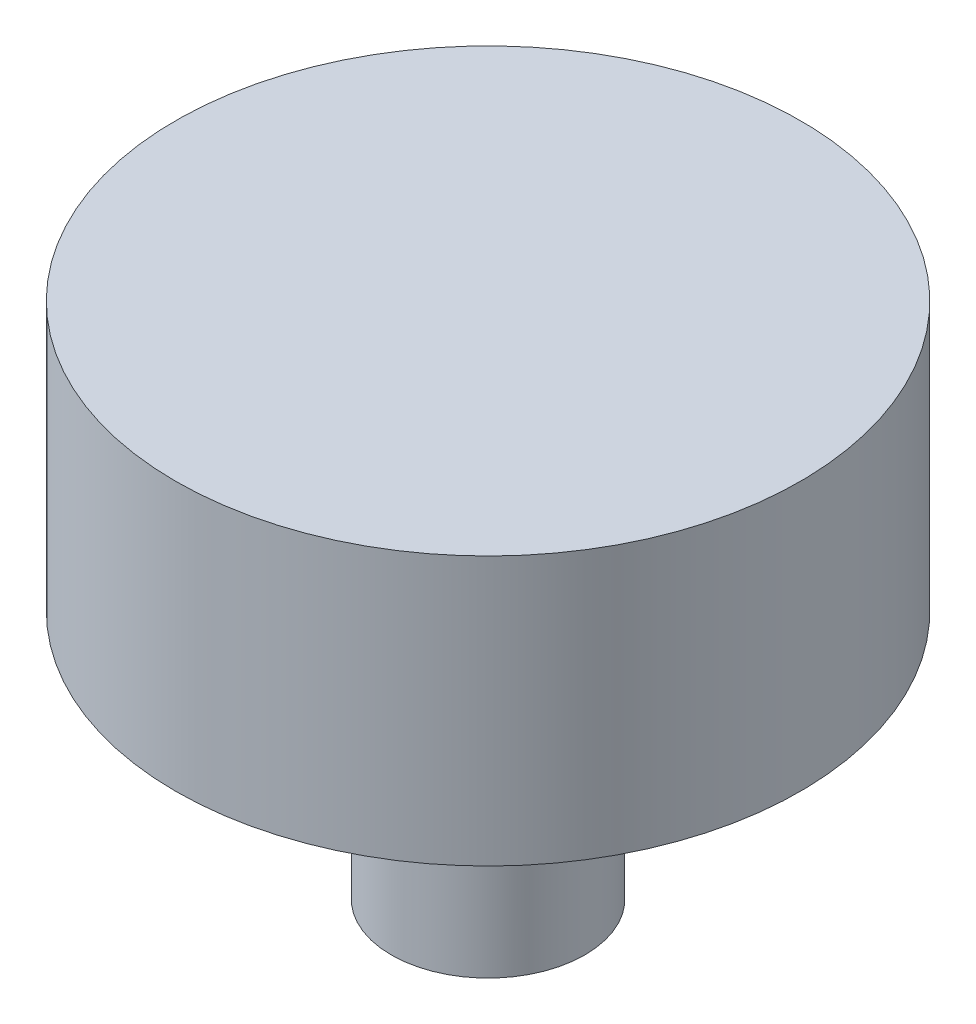
ISO-10303-21;
HEADER;
FILE_DESCRIPTION(('STEP AP214'),'2;1');
FILE_NAME('part.step','',(''),(''),'','','');
FILE_SCHEMA(('AUTOMOTIVE_DESIGN { 1 0 10303 214 1 1 1 1 }'));
ENDSEC;
DATA;
#1=APPLICATION_CONTEXT('core data for automotive mechanical design processes');
#2=APPLICATION_PROTOCOL_DEFINITION('international standard','automotive_design',2000,#1);
#3=PRODUCT_CONTEXT('',#1,'mechanical');
#4=PRODUCT('Part','Part','',(#3));
#5=PRODUCT_RELATED_PRODUCT_CATEGORY('part','',(#4));
#6=PRODUCT_DEFINITION_FORMATION('','',#4);
#7=PRODUCT_DEFINITION_CONTEXT('part definition',#1,'design');
#8=PRODUCT_DEFINITION('design','',#6,#7);
#9=PRODUCT_DEFINITION_SHAPE('','',#8);
#10=(LENGTH_UNIT() NAMED_UNIT(*) SI_UNIT(.MILLI.,.METRE.));
#11=(NAMED_UNIT(*) PLANE_ANGLE_UNIT() SI_UNIT($,.RADIAN.));
#12=(NAMED_UNIT(*) SI_UNIT($,.STERADIAN.) SOLID_ANGLE_UNIT());
#13=UNCERTAINTY_MEASURE_WITH_UNIT(LENGTH_MEASURE(1.E-05),#10,'distance_accuracy_value','');
#14=(GEOMETRIC_REPRESENTATION_CONTEXT(3) GLOBAL_UNCERTAINTY_ASSIGNED_CONTEXT((#13)) GLOBAL_UNIT_ASSIGNED_CONTEXT((#10,
#11,#12)) REPRESENTATION_CONTEXT('',''));
#15=CARTESIAN_POINT('',(0.,0.,0.));
#16=DIRECTION('',(0.,0.,1.));
#17=DIRECTION('',(1.,0.,0.));
#18=AXIS2_PLACEMENT_3D('',#15,#16,#17);
#19=CARTESIAN_POINT('',(0.,0.,0.));
#20=DIRECTION('',(0.,1.,0.));
#21=DIRECTION('',(0.,0.,1.));
#22=AXIS2_PLACEMENT_3D('',#19,#20,#21);
#23=PLANE('',#22);
#24=CARTESIAN_POINT('',(0.,0.,0.));
#25=DIRECTION('',(0.,1.,0.));
#26=DIRECTION('',(0.,0.,1.));
#27=AXIS2_PLACEMENT_3D('',#24,#25,#26);
#28=CIRCLE('',#27,20.701);
#29=CARTESIAN_POINT('',(0.,0.,20.701));
#30=VERTEX_POINT('',#29);
#31=EDGE_CURVE('E41',#30,#30,#28,.T.);
#32=ORIENTED_EDGE('',*,*,#31,.F.);
#33=EDGE_LOOP('',(#32));
#34=FACE_BOUND('',#33,.T.);
#35=CARTESIAN_POINT('',(0.,0.,0.));
#36=DIRECTION('',(0.,1.,0.));
#37=DIRECTION('',(0.,0.,1.));
#38=AXIS2_PLACEMENT_3D('',#35,#36,#37);
#39=CIRCLE('',#38,6.4135);
#40=CARTESIAN_POINT('',(0.,0.,6.4135));
#41=VERTEX_POINT('',#40);
#42=EDGE_CURVE('E10',#41,#41,#39,.F.);
#43=ORIENTED_EDGE('',*,*,#42,.F.);
#44=EDGE_LOOP('',(#43));
#45=FACE_BOUND('',#44,.T.);
#46=ADVANCED_FACE('F30',(#34,#45),#23,.F.);
#47=CARTESIAN_POINT('',(0.,17.7927,0.));
#48=DIRECTION('',(0.,-1.,0.));
#49=DIRECTION('',(0.,0.,-1.));
#50=AXIS2_PLACEMENT_3D('',#47,#48,#49);
#51=CYLINDRICAL_SURFACE('',#50,20.701);
#52=CARTESIAN_POINT('',(0.,17.7927,0.));
#53=DIRECTION('',(0.,1.,0.));
#54=DIRECTION('',(0.,0.,1.));
#55=AXIS2_PLACEMENT_3D('',#52,#53,#54);
#56=CIRCLE('',#55,20.701);
#57=CARTESIAN_POINT('',(0.,17.7927,20.701));
#58=VERTEX_POINT('',#57);
#59=EDGE_CURVE('E37',#58,#58,#56,.T.);
#60=ORIENTED_EDGE('',*,*,#59,.F.);
#61=EDGE_LOOP('',(#60));
#62=FACE_BOUND('',#61,.T.);
#63=ORIENTED_EDGE('',*,*,#31,.T.);
#64=EDGE_LOOP('',(#63));
#65=FACE_BOUND('',#64,.T.);
#66=ADVANCED_FACE('F32',(#62,#65),#51,.T.);
#67=CARTESIAN_POINT('',(0.,17.7927,0.));
#68=DIRECTION('',(0.,1.,0.));
#69=DIRECTION('',(0.,0.,1.));
#70=AXIS2_PLACEMENT_3D('',#67,#68,#69);
#71=PLANE('',#70);
#72=ORIENTED_EDGE('',*,*,#59,.T.);
#73=EDGE_LOOP('',(#72));
#74=FACE_BOUND('',#73,.T.);
#75=ADVANCED_FACE('F55',(#74),#71,.T.);
#76=CARTESIAN_POINT('',(0.,-16.5354,0.));
#77=DIRECTION('',(0.,1.,0.));
#78=DIRECTION('',(0.,0.,1.));
#79=AXIS2_PLACEMENT_3D('',#76,#77,#78);
#80=CYLINDRICAL_SURFACE('',#79,6.4135);
#81=CARTESIAN_POINT('',(0.,-16.5354,0.));
#82=DIRECTION('',(0.,-1.,0.));
#83=DIRECTION('',(0.,0.,-1.));
#84=AXIS2_PLACEMENT_3D('',#81,#82,#83);
#85=CIRCLE('',#84,6.4135);
#86=CARTESIAN_POINT('',(0.,-16.5354,-6.4135));
#87=VERTEX_POINT('',#86);
#88=EDGE_CURVE('E46',#87,#87,#85,.T.);
#89=ORIENTED_EDGE('',*,*,#88,.F.);
#90=EDGE_LOOP('',(#89));
#91=FACE_BOUND('',#90,.T.);
#92=ORIENTED_EDGE('',*,*,#42,.T.);
#93=EDGE_LOOP('',(#92));
#94=FACE_BOUND('',#93,.T.);
#95=ADVANCED_FACE('F53',(#91,#94),#80,.T.);
#96=CARTESIAN_POINT('',(0.,-16.5354,0.));
#97=DIRECTION('',(0.,-1.,0.));
#98=DIRECTION('',(0.,0.,-1.));
#99=AXIS2_PLACEMENT_3D('',#96,#97,#98);
#100=PLANE('',#99);
#101=ORIENTED_EDGE('',*,*,#88,.T.);
#102=EDGE_LOOP('',(#101));
#103=FACE_BOUND('',#102,.T.);
#104=ADVANCED_FACE('F51',(#103),#100,.T.);
#105=CLOSED_SHELL('',(#46,#66,#75,#95,#104));
#106=MANIFOLD_SOLID_BREP('B2',#105);
#107=ADVANCED_BREP_SHAPE_REPRESENTATION('',(#18,#106),#14);
#108=SHAPE_DEFINITION_REPRESENTATION(#9,#107);
ENDSEC;
END-ISO-10303-21;
